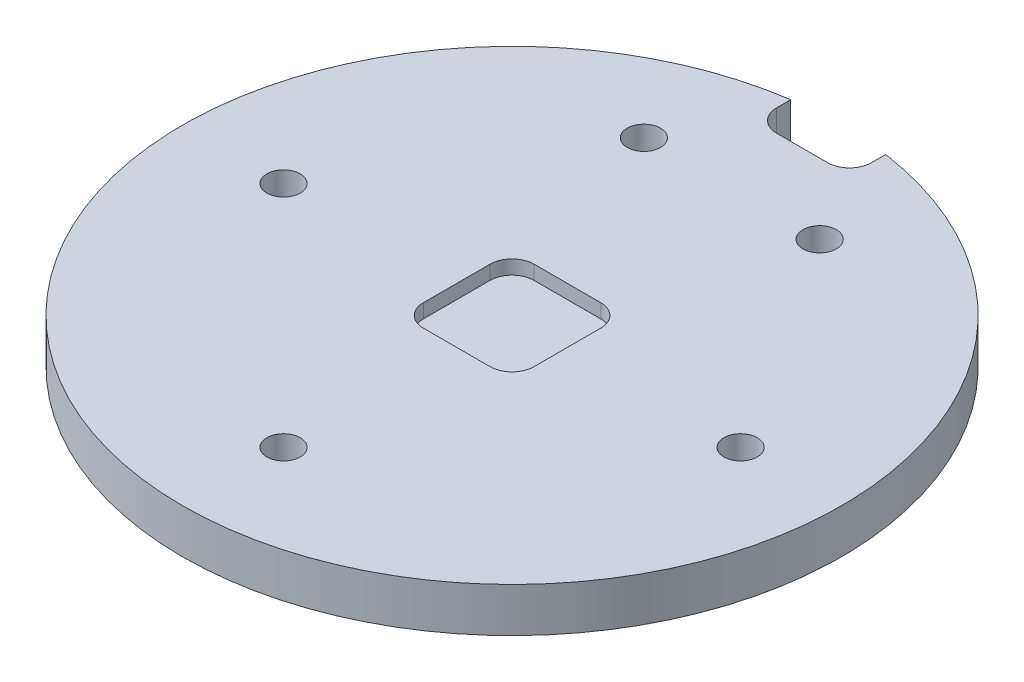
ISO-10303-21;
HEADER;
FILE_DESCRIPTION(('STEP AP214'),'2;1');
FILE_NAME('part.step','',(''),(''),'','','');
FILE_SCHEMA(('AUTOMOTIVE_DESIGN { 1 0 10303 214 1 1 1 1 }'));
ENDSEC;
DATA;
#1=APPLICATION_CONTEXT('core data for automotive mechanical design processes');
#2=APPLICATION_PROTOCOL_DEFINITION('international standard','automotive_design',2000,#1);
#3=PRODUCT_CONTEXT('',#1,'mechanical');
#4=PRODUCT('Part','Part','',(#3));
#5=PRODUCT_RELATED_PRODUCT_CATEGORY('part','',(#4));
#6=PRODUCT_DEFINITION_FORMATION('','',#4);
#7=PRODUCT_DEFINITION_CONTEXT('part definition',#1,'design');
#8=PRODUCT_DEFINITION('design','',#6,#7);
#9=PRODUCT_DEFINITION_SHAPE('','',#8);
#10=(LENGTH_UNIT() NAMED_UNIT(*) SI_UNIT(.MILLI.,.METRE.));
#11=(NAMED_UNIT(*) PLANE_ANGLE_UNIT() SI_UNIT($,.RADIAN.));
#12=(NAMED_UNIT(*) SI_UNIT($,.STERADIAN.) SOLID_ANGLE_UNIT());
#13=UNCERTAINTY_MEASURE_WITH_UNIT(LENGTH_MEASURE(1.E-05),#10,'distance_accuracy_value','');
#14=(GEOMETRIC_REPRESENTATION_CONTEXT(3) GLOBAL_UNCERTAINTY_ASSIGNED_CONTEXT((#13)) GLOBAL_UNIT_ASSIGNED_CONTEXT((#10,
#11,#12)) REPRESENTATION_CONTEXT('',''));
#15=CARTESIAN_POINT('',(0.,0.,0.));
#16=DIRECTION('',(0.,0.,1.));
#17=DIRECTION('',(1.,0.,0.));
#18=AXIS2_PLACEMENT_3D('',#15,#16,#17);
#19=CARTESIAN_POINT('',(-6.85799999999999,0.0500000000000014,-38.493867511592));
#20=DIRECTION('',(0.,1.,0.));
#21=DIRECTION('',(0.,0.,1.));
#22=AXIS2_PLACEMENT_3D('',#19,#20,#21);
#23=PLANE('',#22);
#24=CARTESIAN_POINT('',(12.7,0.0500000000000014,-31.75));
#25=DIRECTION('',(0.,1.,0.));
#26=DIRECTION('',(0.,0.,1.));
#27=AXIS2_PLACEMENT_3D('',#24,#25,#26);
#28=CIRCLE('',#27,2.413);
#29=CARTESIAN_POINT('',(12.7,0.0500000000000014,-29.337));
#30=VERTEX_POINT('',#29);
#31=EDGE_CURVE('E458',#30,#30,#28,.T.);
#32=ORIENTED_EDGE('',*,*,#31,.F.);
#33=EDGE_LOOP('',(#32));
#34=FACE_BOUND('',#33,.T.);
#35=CARTESIAN_POINT('',(-12.7,0.0500000000000014,-31.75));
#36=DIRECTION('',(0.,1.,0.));
#37=DIRECTION('',(0.,0.,1.));
#38=AXIS2_PLACEMENT_3D('',#35,#36,#37);
#39=CIRCLE('',#38,2.413);
#40=CARTESIAN_POINT('',(-12.7,0.0500000000000014,-29.337));
#41=VERTEX_POINT('',#40);
#42=EDGE_CURVE('E460',#41,#41,#39,.T.);
#43=ORIENTED_EDGE('',*,*,#42,.F.);
#44=EDGE_LOOP('',(#43));
#45=FACE_BOUND('',#44,.T.);
#46=CARTESIAN_POINT('',(0.,0.0500000000000014,33.02));
#47=DIRECTION('',(0.,1.,0.));
#48=DIRECTION('',(0.,0.,1.));
#49=AXIS2_PLACEMENT_3D('',#46,#47,#48);
#50=CIRCLE('',#49,2.413);
#51=CARTESIAN_POINT('',(0.,0.0500000000000014,35.433));
#52=VERTEX_POINT('',#51);
#53=EDGE_CURVE('E466',#52,#52,#50,.T.);
#54=ORIENTED_EDGE('',*,*,#53,.F.);
#55=EDGE_LOOP('',(#54));
#56=FACE_BOUND('',#55,.T.);
#57=CARTESIAN_POINT('',(33.02,0.0500000000000014,0.));
#58=DIRECTION('',(0.,1.,0.));
#59=DIRECTION('',(0.,0.,1.));
#60=AXIS2_PLACEMENT_3D('',#57,#58,#59);
#61=CIRCLE('',#60,2.413);
#62=CARTESIAN_POINT('',(33.02,0.0500000000000014,2.413));
#63=VERTEX_POINT('',#62);
#64=EDGE_CURVE('E472',#63,#63,#61,.T.);
#65=ORIENTED_EDGE('',*,*,#64,.F.);
#66=EDGE_LOOP('',(#65));
#67=FACE_BOUND('',#66,.T.);
#68=CARTESIAN_POINT('',(-33.02,0.0500000000000014,0.));
#69=DIRECTION('',(0.,1.,0.));
#70=DIRECTION('',(0.,0.,1.));
#71=AXIS2_PLACEMENT_3D('',#68,#69,#70);
#72=CIRCLE('',#71,2.413);
#73=CARTESIAN_POINT('',(-33.02,0.0500000000000014,2.413));
#74=VERTEX_POINT('',#73);
#75=EDGE_CURVE('E478',#74,#74,#72,.T.);
#76=ORIENTED_EDGE('',*,*,#75,.F.);
#77=EDGE_LOOP('',(#76));
#78=FACE_BOUND('',#77,.T.);
#79=DIRECTION('',(0.,0.,-1.));
#80=VECTOR('',#79,1.);
#81=CARTESIAN_POINT('',(6.85799999999999,0.0500000000000014,-41.91));
#82=LINE('',#81,#80);
#83=CARTESIAN_POINT('',(6.85799999999999,0.0500000000000014,-45.085));
#84=VERTEX_POINT('',#83);
#85=CARTESIAN_POINT('',(6.85799999999999,0.0500000000000014,-47.1286373768646));
#86=VERTEX_POINT('',#85);
#87=EDGE_CURVE('E168',#84,#86,#82,.T.);
#88=ORIENTED_EDGE('',*,*,#87,.F.);
#89=CARTESIAN_POINT('',(3.68299999999999,0.0500000000000014,-45.085));
#90=DIRECTION('',(0.,1.,0.));
#91=DIRECTION('',(0.,0.,1.));
#92=AXIS2_PLACEMENT_3D('',#89,#90,#91);
#93=CIRCLE('',#92,3.175);
#94=CARTESIAN_POINT('',(3.68299999999999,0.0500000000000014,-41.91));
#95=VERTEX_POINT('',#94);
#96=EDGE_CURVE('E215',#84,#95,#93,.F.);
#97=ORIENTED_EDGE('',*,*,#96,.T.);
#98=DIRECTION('',(1.,0.,0.));
#99=VECTOR('',#98,1.);
#100=CARTESIAN_POINT('',(6.85799999999999,0.0500000000000014,-41.91));
#101=LINE('',#100,#99);
#102=CARTESIAN_POINT('',(-3.68300000000003,0.0500000000000014,-41.91));
#103=VERTEX_POINT('',#102);
#104=EDGE_CURVE('E167',#103,#95,#101,.T.);
#105=ORIENTED_EDGE('',*,*,#104,.F.);
#106=CARTESIAN_POINT('',(-3.68300000000003,0.0500000000000014,-45.085));
#107=DIRECTION('',(0.,1.,0.));
#108=DIRECTION('',(0.,0.,1.));
#109=AXIS2_PLACEMENT_3D('',#106,#107,#108);
#110=CIRCLE('',#109,3.175);
#111=CARTESIAN_POINT('',(-6.85800000000003,0.0500000000000014,-45.085));
#112=VERTEX_POINT('',#111);
#113=EDGE_CURVE('E166',#103,#112,#110,.F.);
#114=ORIENTED_EDGE('',*,*,#113,.T.);
#115=DIRECTION('',(0.,0.,1.));
#116=VECTOR('',#115,1.);
#117=CARTESIAN_POINT('',(-6.85800000000003,0.0500000000000014,-41.91));
#118=LINE('',#117,#116);
#119=CARTESIAN_POINT('',(-6.85800000000003,0.0500000000000014,-47.1286373768646));
#120=VERTEX_POINT('',#119);
#121=EDGE_CURVE('E150',#120,#112,#118,.T.);
#122=ORIENTED_EDGE('',*,*,#121,.F.);
#123=CARTESIAN_POINT('',(0.,0.0500000000000014,0.));
#124=DIRECTION('',(0.,1.,0.));
#125=DIRECTION('',(0.,0.,1.));
#126=AXIS2_PLACEMENT_3D('',#123,#124,#125);
#127=CIRCLE('',#126,47.625);
#128=EDGE_CURVE('E164',#86,#120,#127,.F.);
#129=ORIENTED_EDGE('',*,*,#128,.F.);
#130=EDGE_LOOP('',(#88,#97,#105,#114,#122,#129));
#131=FACE_BOUND('',#130,.T.);
#132=DIRECTION('',(0.,0.,-1.));
#133=VECTOR('',#132,1.);
#134=CARTESIAN_POINT('',(8.,0.0500000000000014,-8.00000000000001));
#135=LINE('',#134,#133);
#136=CARTESIAN_POINT('',(8.,0.0500000000000014,4.82499999999999));
#137=VERTEX_POINT('',#136);
#138=CARTESIAN_POINT('',(8.,0.0500000000000014,-4.82500000000001));
#139=VERTEX_POINT('',#138);
#140=EDGE_CURVE('E189',#137,#139,#135,.T.);
#141=ORIENTED_EDGE('',*,*,#140,.F.);
#142=CARTESIAN_POINT('',(4.825,0.0500000000000014,4.82499999999999));
#143=DIRECTION('',(0.,1.,0.));
#144=DIRECTION('',(0.,0.,1.));
#145=AXIS2_PLACEMENT_3D('',#142,#143,#144);
#146=CIRCLE('',#145,3.175);
#147=CARTESIAN_POINT('',(4.825,0.0500000000000014,7.99999999999999));
#148=VERTEX_POINT('',#147);
#149=EDGE_CURVE('E13',#137,#148,#146,.F.);
#150=ORIENTED_EDGE('',*,*,#149,.T.);
#151=DIRECTION('',(1.,0.,0.));
#152=VECTOR('',#151,1.);
#153=CARTESIAN_POINT('',(-8.,0.0500000000000014,7.99999999999999));
#154=LINE('',#153,#152);
#155=CARTESIAN_POINT('',(-4.825,0.0500000000000014,7.99999999999999));
#156=VERTEX_POINT('',#155);
#157=EDGE_CURVE('E179',#156,#148,#154,.T.);
#158=ORIENTED_EDGE('',*,*,#157,.F.);
#159=CARTESIAN_POINT('',(-4.825,0.0500000000000014,4.82499999999999));
#160=DIRECTION('',(0.,1.,0.));
#161=DIRECTION('',(0.,0.,1.));
#162=AXIS2_PLACEMENT_3D('',#159,#160,#161);
#163=CIRCLE('',#162,3.175);
#164=CARTESIAN_POINT('',(-8.,0.0500000000000014,4.82499999999999));
#165=VERTEX_POINT('',#164);
#166=EDGE_CURVE('E248',#156,#165,#163,.F.);
#167=ORIENTED_EDGE('',*,*,#166,.T.);
#168=DIRECTION('',(0.,0.,1.));
#169=VECTOR('',#168,1.);
#170=CARTESIAN_POINT('',(-8.,0.0500000000000014,-8.00000000000001));
#171=LINE('',#170,#169);
#172=CARTESIAN_POINT('',(-8.,0.0500000000000014,-4.82500000000001));
#173=VERTEX_POINT('',#172);
#174=EDGE_CURVE('E182',#173,#165,#171,.T.);
#175=ORIENTED_EDGE('',*,*,#174,.F.);
#176=CARTESIAN_POINT('',(-4.825,0.0500000000000014,-4.82500000000001));
#177=DIRECTION('',(0.,1.,0.));
#178=DIRECTION('',(0.,0.,1.));
#179=AXIS2_PLACEMENT_3D('',#176,#177,#178);
#180=CIRCLE('',#179,3.175);
#181=CARTESIAN_POINT('',(-4.825,0.0500000000000014,-8.00000000000001));
#182=VERTEX_POINT('',#181);
#183=EDGE_CURVE('E246',#173,#182,#180,.F.);
#184=ORIENTED_EDGE('',*,*,#183,.T.);
#185=DIRECTION('',(-1.,0.,0.));
#186=VECTOR('',#185,1.);
#187=CARTESIAN_POINT('',(-8.,0.0500000000000014,-8.00000000000001));
#188=LINE('',#187,#186);
#189=CARTESIAN_POINT('',(4.825,0.0500000000000014,-8.00000000000001));
#190=VERTEX_POINT('',#189);
#191=EDGE_CURVE('E186',#190,#182,#188,.T.);
#192=ORIENTED_EDGE('',*,*,#191,.F.);
#193=CARTESIAN_POINT('',(4.825,0.0500000000000014,-4.82500000000001));
#194=DIRECTION('',(0.,1.,0.));
#195=DIRECTION('',(0.,0.,1.));
#196=AXIS2_PLACEMENT_3D('',#193,#194,#195);
#197=CIRCLE('',#196,3.175);
#198=EDGE_CURVE('E55',#190,#139,#197,.F.);
#199=ORIENTED_EDGE('',*,*,#198,.T.);
#200=EDGE_LOOP('',(#141,#150,#158,#167,#175,#184,#192,#199));
#201=FACE_BOUND('',#200,.T.);
#202=ADVANCED_FACE('F47',(#34,#45,#56,#67,#78,#131,#201),#23,.T.);
#203=CARTESIAN_POINT('',(-8.,-1.982,7.99999999999999));
#204=DIRECTION('',(0.,0.,1.));
#205=DIRECTION('',(1.,0.,0.));
#206=AXIS2_PLACEMENT_3D('',#203,#204,#205);
#207=PLANE('',#206);
#208=DIRECTION('',(1.,0.,0.));
#209=VECTOR('',#208,1.);
#210=CARTESIAN_POINT('',(-8.,-1.982,7.99999999999999));
#211=LINE('',#210,#209);
#212=CARTESIAN_POINT('',(-4.825,-1.982,7.99999999999999));
#213=VERTEX_POINT('',#212);
#214=CARTESIAN_POINT('',(4.825,-1.982,7.99999999999999));
#215=VERTEX_POINT('',#214);
#216=EDGE_CURVE('E175',#213,#215,#211,.T.);
#217=ORIENTED_EDGE('',*,*,#216,.F.);
#218=DIRECTION('',(0.,1.,0.));
#219=VECTOR('',#218,1.);
#220=CARTESIAN_POINT('',(-4.825,0.0500000000000014,7.99999999999999));
#221=LINE('',#220,#219);
#222=EDGE_CURVE('E239',#213,#156,#221,.T.);
#223=ORIENTED_EDGE('',*,*,#222,.T.);
#224=ORIENTED_EDGE('',*,*,#157,.T.);
#225=DIRECTION('',(0.,1.,0.));
#226=VECTOR('',#225,1.);
#227=CARTESIAN_POINT('',(4.825,-1.982,7.99999999999999));
#228=LINE('',#227,#226);
#229=EDGE_CURVE('E237',#148,#215,#228,.F.);
#230=ORIENTED_EDGE('',*,*,#229,.T.);
#231=EDGE_LOOP('',(#217,#223,#224,#230));
#232=FACE_BOUND('',#231,.T.);
#233=ADVANCED_FACE('F265',(#232),#207,.F.);
#234=CARTESIAN_POINT('',(8.,-1.982,-8.00000000000001));
#235=DIRECTION('',(1.,0.,0.));
#236=DIRECTION('',(0.,0.,-1.));
#237=AXIS2_PLACEMENT_3D('',#234,#235,#236);
#238=PLANE('',#237);
#239=ORIENTED_EDGE('',*,*,#140,.T.);
#240=DIRECTION('',(0.,1.,0.));
#241=VECTOR('',#240,1.);
#242=CARTESIAN_POINT('',(8.,-1.982,-4.82500000000001));
#243=LINE('',#242,#241);
#244=CARTESIAN_POINT('',(8.,-1.982,-4.82500000000001));
#245=VERTEX_POINT('',#244);
#246=EDGE_CURVE('E244',#139,#245,#243,.F.);
#247=ORIENTED_EDGE('',*,*,#246,.T.);
#248=DIRECTION('',(0.,0.,-1.));
#249=VECTOR('',#248,1.);
#250=CARTESIAN_POINT('',(8.,-1.982,-8.00000000000001));
#251=LINE('',#250,#249);
#252=CARTESIAN_POINT('',(8.,-1.982,4.82499999999999));
#253=VERTEX_POINT('',#252);
#254=EDGE_CURVE('E183',#253,#245,#251,.T.);
#255=ORIENTED_EDGE('',*,*,#254,.F.);
#256=DIRECTION('',(0.,1.,0.));
#257=VECTOR('',#256,1.);
#258=CARTESIAN_POINT('',(8.,0.0500000000000014,4.82499999999999));
#259=LINE('',#258,#257);
#260=EDGE_CURVE('E242',#253,#137,#259,.T.);
#261=ORIENTED_EDGE('',*,*,#260,.T.);
#262=EDGE_LOOP('',(#239,#247,#255,#261));
#263=FACE_BOUND('',#262,.T.);
#264=ADVANCED_FACE('F269',(#263),#238,.F.);
#265=CARTESIAN_POINT('',(0.,-1.982,0.));
#266=DIRECTION('',(0.,1.,0.));
#267=DIRECTION('',(0.,0.,1.));
#268=AXIS2_PLACEMENT_3D('',#265,#266,#267);
#269=PLANE('',#268);
#270=DIRECTION('',(-1.,0.,0.));
#271=VECTOR('',#270,1.);
#272=CARTESIAN_POINT('',(-8.,-1.982,-8.00000000000001));
#273=LINE('',#272,#271);
#274=CARTESIAN_POINT('',(4.825,-1.982,-8.00000000000001));
#275=VERTEX_POINT('',#274);
#276=CARTESIAN_POINT('',(-4.825,-1.982,-8.00000000000001));
#277=VERTEX_POINT('',#276);
#278=EDGE_CURVE('E196',#275,#277,#273,.T.);
#279=ORIENTED_EDGE('',*,*,#278,.T.);
#280=CARTESIAN_POINT('',(-4.825,-1.982,-4.82500000000001));
#281=DIRECTION('',(0.,1.,0.));
#282=DIRECTION('',(0.,0.,1.));
#283=AXIS2_PLACEMENT_3D('',#280,#281,#282);
#284=CIRCLE('',#283,3.175);
#285=CARTESIAN_POINT('',(-8.,-1.982,-4.82500000000001));
#286=VERTEX_POINT('',#285);
#287=EDGE_CURVE('E235',#277,#286,#284,.T.);
#288=ORIENTED_EDGE('',*,*,#287,.T.);
#289=DIRECTION('',(0.,0.,1.));
#290=VECTOR('',#289,1.);
#291=CARTESIAN_POINT('',(-8.,-1.982,-8.00000000000001));
#292=LINE('',#291,#290);
#293=CARTESIAN_POINT('',(-8.,-1.982,4.82499999999999));
#294=VERTEX_POINT('',#293);
#295=EDGE_CURVE('E193',#286,#294,#292,.T.);
#296=ORIENTED_EDGE('',*,*,#295,.T.);
#297=CARTESIAN_POINT('',(-4.825,-1.982,4.82499999999999));
#298=DIRECTION('',(0.,1.,0.));
#299=DIRECTION('',(0.,0.,1.));
#300=AXIS2_PLACEMENT_3D('',#297,#298,#299);
#301=CIRCLE('',#300,3.175);
#302=EDGE_CURVE('E233',#294,#213,#301,.T.);
#303=ORIENTED_EDGE('',*,*,#302,.T.);
#304=ORIENTED_EDGE('',*,*,#216,.T.);
#305=CARTESIAN_POINT('',(4.825,-1.982,4.82499999999999));
#306=DIRECTION('',(0.,1.,0.));
#307=DIRECTION('',(0.,0.,1.));
#308=AXIS2_PLACEMENT_3D('',#305,#306,#307);
#309=CIRCLE('',#308,3.175);
#310=EDGE_CURVE('E229',#215,#253,#309,.T.);
#311=ORIENTED_EDGE('',*,*,#310,.T.);
#312=ORIENTED_EDGE('',*,*,#254,.T.);
#313=CARTESIAN_POINT('',(4.825,-1.982,-4.82500000000001));
#314=DIRECTION('',(0.,1.,0.));
#315=DIRECTION('',(0.,0.,1.));
#316=AXIS2_PLACEMENT_3D('',#313,#314,#315);
#317=CIRCLE('',#316,3.175);
#318=EDGE_CURVE('E231',#245,#275,#317,.T.);
#319=ORIENTED_EDGE('',*,*,#318,.T.);
#320=EDGE_LOOP('',(#279,#288,#296,#303,#304,#311,#312,#319));
#321=FACE_BOUND('',#320,.T.);
#322=ADVANCED_FACE('F262',(#321),#269,.T.);
#323=CARTESIAN_POINT('',(-8.,-1.982,-8.00000000000001));
#324=DIRECTION('',(-1.,0.,0.));
#325=DIRECTION('',(0.,0.,1.));
#326=AXIS2_PLACEMENT_3D('',#323,#324,#325);
#327=PLANE('',#326);
#328=ORIENTED_EDGE('',*,*,#295,.F.);
#329=DIRECTION('',(0.,1.,0.));
#330=VECTOR('',#329,1.);
#331=CARTESIAN_POINT('',(-8.,0.0500000000000014,-4.82500000000001));
#332=LINE('',#331,#330);
#333=EDGE_CURVE('E221',#286,#173,#332,.T.);
#334=ORIENTED_EDGE('',*,*,#333,.T.);
#335=ORIENTED_EDGE('',*,*,#174,.T.);
#336=DIRECTION('',(0.,1.,0.));
#337=VECTOR('',#336,1.);
#338=CARTESIAN_POINT('',(-8.,-1.982,4.82499999999999));
#339=LINE('',#338,#337);
#340=EDGE_CURVE('E219',#165,#294,#339,.F.);
#341=ORIENTED_EDGE('',*,*,#340,.T.);
#342=EDGE_LOOP('',(#328,#334,#335,#341));
#343=FACE_BOUND('',#342,.T.);
#344=ADVANCED_FACE('F256',(#343),#327,.F.);
#345=CARTESIAN_POINT('',(-8.,-1.982,-8.00000000000001));
#346=DIRECTION('',(0.,0.,-1.));
#347=DIRECTION('',(-1.,0.,0.));
#348=AXIS2_PLACEMENT_3D('',#345,#346,#347);
#349=PLANE('',#348);
#350=ORIENTED_EDGE('',*,*,#191,.T.);
#351=DIRECTION('',(0.,1.,0.));
#352=VECTOR('',#351,1.);
#353=CARTESIAN_POINT('',(-4.825,-1.982,-8.00000000000001));
#354=LINE('',#353,#352);
#355=EDGE_CURVE('E227',#182,#277,#354,.F.);
#356=ORIENTED_EDGE('',*,*,#355,.T.);
#357=ORIENTED_EDGE('',*,*,#278,.F.);
#358=DIRECTION('',(0.,1.,0.));
#359=VECTOR('',#358,1.);
#360=CARTESIAN_POINT('',(4.825,0.0500000000000014,-8.00000000000001));
#361=LINE('',#360,#359);
#362=EDGE_CURVE('E224',#275,#190,#361,.T.);
#363=ORIENTED_EDGE('',*,*,#362,.T.);
#364=EDGE_LOOP('',(#350,#356,#357,#363));
#365=FACE_BOUND('',#364,.T.);
#366=ADVANCED_FACE('F277',(#365),#349,.F.);
#367=CARTESIAN_POINT('',(0.,-6.35,0.));
#368=DIRECTION('',(0.,1.,0.));
#369=DIRECTION('',(0.,0.,1.));
#370=AXIS2_PLACEMENT_3D('',#367,#368,#369);
#371=CYLINDRICAL_SURFACE('',#370,47.625);
#372=DIRECTION('',(0.,1.,0.));
#373=VECTOR('',#372,1.);
#374=CARTESIAN_POINT('',(6.85799999999999,-6.35,-47.1286373768646));
#375=LINE('',#374,#373);
#376=CARTESIAN_POINT('',(6.85799999999999,-6.35,-47.1286373768646));
#377=VERTEX_POINT('',#376);
#378=EDGE_CURVE('E158',#86,#377,#375,.F.);
#379=ORIENTED_EDGE('',*,*,#378,.F.);
#380=ORIENTED_EDGE('',*,*,#128,.T.);
#381=DIRECTION('',(0.,1.,0.));
#382=VECTOR('',#381,1.);
#383=CARTESIAN_POINT('',(-6.85800000000003,-6.35,-47.1286373768646));
#384=LINE('',#383,#382);
#385=CARTESIAN_POINT('',(-6.85800000000003,-6.35,-47.1286373768646));
#386=VERTEX_POINT('',#385);
#387=EDGE_CURVE('E147',#386,#120,#384,.T.);
#388=ORIENTED_EDGE('',*,*,#387,.F.);
#389=CARTESIAN_POINT('',(0.,-6.35,0.));
#390=DIRECTION('',(0.,1.,0.));
#391=DIRECTION('',(0.,0.,1.));
#392=AXIS2_PLACEMENT_3D('',#389,#390,#391);
#393=CIRCLE('',#392,47.625);
#394=EDGE_CURVE('E173',#386,#377,#393,.T.);
#395=ORIENTED_EDGE('',*,*,#394,.T.);
#396=EDGE_LOOP('',(#379,#380,#388,#395));
#397=FACE_BOUND('',#396,.T.);
#398=ADVANCED_FACE('F171',(#397),#371,.T.);
#399=CARTESIAN_POINT('',(0.,-6.35,0.));
#400=DIRECTION('',(0.,1.,0.));
#401=DIRECTION('',(0.,0.,1.));
#402=AXIS2_PLACEMENT_3D('',#399,#400,#401);
#403=PLANE('',#402);
#404=CARTESIAN_POINT('',(12.7,-6.35,-31.75));
#405=DIRECTION('',(0.,1.,0.));
#406=DIRECTION('',(0.,0.,1.));
#407=AXIS2_PLACEMENT_3D('',#404,#405,#406);
#408=CIRCLE('',#407,2.413);
#409=CARTESIAN_POINT('',(12.7,-6.35,-29.337));
#410=VERTEX_POINT('',#409);
#411=EDGE_CURVE('E455',#410,#410,#408,.T.);
#412=ORIENTED_EDGE('',*,*,#411,.T.);
#413=EDGE_LOOP('',(#412));
#414=FACE_BOUND('',#413,.T.);
#415=CARTESIAN_POINT('',(-12.7,-6.35,-31.75));
#416=DIRECTION('',(0.,1.,0.));
#417=DIRECTION('',(0.,0.,1.));
#418=AXIS2_PLACEMENT_3D('',#415,#416,#417);
#419=CIRCLE('',#418,2.413);
#420=CARTESIAN_POINT('',(-12.7,-6.35,-29.337));
#421=VERTEX_POINT('',#420);
#422=EDGE_CURVE('E463',#421,#421,#419,.T.);
#423=ORIENTED_EDGE('',*,*,#422,.T.);
#424=EDGE_LOOP('',(#423));
#425=FACE_BOUND('',#424,.T.);
#426=CARTESIAN_POINT('',(0.,-6.35,33.02));
#427=DIRECTION('',(0.,1.,0.));
#428=DIRECTION('',(0.,0.,1.));
#429=AXIS2_PLACEMENT_3D('',#426,#427,#428);
#430=CIRCLE('',#429,2.413);
#431=CARTESIAN_POINT('',(0.,-6.35,35.433));
#432=VERTEX_POINT('',#431);
#433=EDGE_CURVE('E469',#432,#432,#430,.T.);
#434=ORIENTED_EDGE('',*,*,#433,.T.);
#435=EDGE_LOOP('',(#434));
#436=FACE_BOUND('',#435,.T.);
#437=CARTESIAN_POINT('',(33.02,-6.35,0.));
#438=DIRECTION('',(0.,1.,0.));
#439=DIRECTION('',(0.,0.,1.));
#440=AXIS2_PLACEMENT_3D('',#437,#438,#439);
#441=CIRCLE('',#440,2.413);
#442=CARTESIAN_POINT('',(33.02,-6.35,2.413));
#443=VERTEX_POINT('',#442);
#444=EDGE_CURVE('E475',#443,#443,#441,.T.);
#445=ORIENTED_EDGE('',*,*,#444,.T.);
#446=EDGE_LOOP('',(#445));
#447=FACE_BOUND('',#446,.T.);
#448=CARTESIAN_POINT('',(-33.02,-6.35,0.));
#449=DIRECTION('',(0.,1.,0.));
#450=DIRECTION('',(0.,0.,1.));
#451=AXIS2_PLACEMENT_3D('',#448,#449,#450);
#452=CIRCLE('',#451,2.413);
#453=CARTESIAN_POINT('',(-33.02,-6.35,2.413));
#454=VERTEX_POINT('',#453);
#455=EDGE_CURVE('E331',#454,#454,#452,.T.);
#456=ORIENTED_EDGE('',*,*,#455,.T.);
#457=EDGE_LOOP('',(#456));
#458=FACE_BOUND('',#457,.T.);
#459=DIRECTION('',(0.,0.,1.));
#460=VECTOR('',#459,1.);
#461=CARTESIAN_POINT('',(-6.85800000000003,-6.35,0.));
#462=LINE('',#461,#460);
#463=CARTESIAN_POINT('',(-6.85800000000003,-6.35,-45.085));
#464=VERTEX_POINT('',#463);
#465=EDGE_CURVE('E153',#386,#464,#462,.T.);
#466=ORIENTED_EDGE('',*,*,#465,.T.);
#467=CARTESIAN_POINT('',(-3.68300000000003,-6.35,-45.085));
#468=DIRECTION('',(0.,1.,0.));
#469=DIRECTION('',(0.,0.,1.));
#470=AXIS2_PLACEMENT_3D('',#467,#468,#469);
#471=CIRCLE('',#470,3.175);
#472=CARTESIAN_POINT('',(-3.68300000000003,-6.35,-41.91));
#473=VERTEX_POINT('',#472);
#474=EDGE_CURVE('E213',#464,#473,#471,.T.);
#475=ORIENTED_EDGE('',*,*,#474,.T.);
#476=DIRECTION('',(1.,0.,0.));
#477=VECTOR('',#476,1.);
#478=CARTESIAN_POINT('',(6.85799999999999,-6.35,-41.91));
#479=LINE('',#478,#477);
#480=CARTESIAN_POINT('',(3.68299999999999,-6.35,-41.91));
#481=VERTEX_POINT('',#480);
#482=EDGE_CURVE('E159',#473,#481,#479,.T.);
#483=ORIENTED_EDGE('',*,*,#482,.T.);
#484=CARTESIAN_POINT('',(3.68299999999999,-6.35,-45.085));
#485=DIRECTION('',(0.,1.,0.));
#486=DIRECTION('',(0.,0.,1.));
#487=AXIS2_PLACEMENT_3D('',#484,#485,#486);
#488=CIRCLE('',#487,3.175);
#489=CARTESIAN_POINT('',(6.85799999999999,-6.35,-45.085));
#490=VERTEX_POINT('',#489);
#491=EDGE_CURVE('E217',#481,#490,#488,.T.);
#492=ORIENTED_EDGE('',*,*,#491,.T.);
#493=DIRECTION('',(0.,0.,-1.));
#494=VECTOR('',#493,1.);
#495=CARTESIAN_POINT('',(6.85799999999999,-6.35,-41.91));
#496=LINE('',#495,#494);
#497=EDGE_CURVE('E326',#490,#377,#496,.T.);
#498=ORIENTED_EDGE('',*,*,#497,.T.);
#499=ORIENTED_EDGE('',*,*,#394,.F.);
#500=EDGE_LOOP('',(#466,#475,#483,#492,#498,#499));
#501=FACE_BOUND('',#500,.T.);
#502=ADVANCED_FACE('F302',(#414,#425,#436,#447,#458,#501),#403,.F.);
#503=CARTESIAN_POINT('',(6.85799999999999,-6.35,-41.91));
#504=DIRECTION('',(1.,0.,0.));
#505=DIRECTION('',(0.,0.,-1.));
#506=AXIS2_PLACEMENT_3D('',#503,#504,#505);
#507=PLANE('',#506);
#508=ORIENTED_EDGE('',*,*,#497,.F.);
#509=DIRECTION('',(0.,1.,0.));
#510=VECTOR('',#509,1.);
#511=CARTESIAN_POINT('',(6.85799999999999,0.0500000000000014,-45.085));
#512=LINE('',#511,#510);
#513=EDGE_CURVE('E209',#490,#84,#512,.T.);
#514=ORIENTED_EDGE('',*,*,#513,.T.);
#515=ORIENTED_EDGE('',*,*,#87,.T.);
#516=ORIENTED_EDGE('',*,*,#378,.T.);
#517=EDGE_LOOP('',(#508,#514,#515,#516));
#518=FACE_BOUND('',#517,.T.);
#519=ADVANCED_FACE('F301',(#518),#507,.F.);
#520=CARTESIAN_POINT('',(6.85799999999999,-6.35,-41.91));
#521=DIRECTION('',(0.,0.,1.));
#522=DIRECTION('',(1.,0.,0.));
#523=AXIS2_PLACEMENT_3D('',#520,#521,#522);
#524=PLANE('',#523);
#525=ORIENTED_EDGE('',*,*,#482,.F.);
#526=DIRECTION('',(0.,1.,0.));
#527=VECTOR('',#526,1.);
#528=CARTESIAN_POINT('',(-3.68300000000003,0.0500000000000014,-41.91));
#529=LINE('',#528,#527);
#530=EDGE_CURVE('E204',#473,#103,#529,.T.);
#531=ORIENTED_EDGE('',*,*,#530,.T.);
#532=ORIENTED_EDGE('',*,*,#104,.T.);
#533=DIRECTION('',(0.,1.,0.));
#534=VECTOR('',#533,1.);
#535=CARTESIAN_POINT('',(3.68299999999999,-6.35,-41.91));
#536=LINE('',#535,#534);
#537=EDGE_CURVE('E202',#95,#481,#536,.F.);
#538=ORIENTED_EDGE('',*,*,#537,.T.);
#539=EDGE_LOOP('',(#525,#531,#532,#538));
#540=FACE_BOUND('',#539,.T.);
#541=ADVANCED_FACE('F315',(#540),#524,.F.);
#542=CARTESIAN_POINT('',(-6.85800000000003,-6.35,-41.91));
#543=DIRECTION('',(-1.,0.,0.));
#544=DIRECTION('',(0.,0.,1.));
#545=AXIS2_PLACEMENT_3D('',#542,#543,#544);
#546=PLANE('',#545);
#547=ORIENTED_EDGE('',*,*,#121,.T.);
#548=DIRECTION('',(0.,1.,0.));
#549=VECTOR('',#548,1.);
#550=CARTESIAN_POINT('',(-6.85800000000003,-6.35,-45.085));
#551=LINE('',#550,#549);
#552=EDGE_CURVE('E207',#112,#464,#551,.F.);
#553=ORIENTED_EDGE('',*,*,#552,.T.);
#554=ORIENTED_EDGE('',*,*,#465,.F.);
#555=ORIENTED_EDGE('',*,*,#387,.T.);
#556=EDGE_LOOP('',(#547,#553,#554,#555));
#557=FACE_BOUND('',#556,.T.);
#558=ADVANCED_FACE('F149',(#557),#546,.F.);
#559=CARTESIAN_POINT('',(-3.68300000000003,-6.35,-45.085));
#560=DIRECTION('',(0.,-1.,0.));
#561=DIRECTION('',(0.,0.,-1.));
#562=AXIS2_PLACEMENT_3D('',#559,#560,#561);
#563=CYLINDRICAL_SURFACE('',#562,3.175);
#564=ORIENTED_EDGE('',*,*,#474,.F.);
#565=ORIENTED_EDGE('',*,*,#552,.F.);
#566=ORIENTED_EDGE('',*,*,#113,.F.);
#567=ORIENTED_EDGE('',*,*,#530,.F.);
#568=EDGE_LOOP('',(#564,#565,#566,#567));
#569=FACE_BOUND('',#568,.T.);
#570=ADVANCED_FACE('F289',(#569),#563,.F.);
#571=CARTESIAN_POINT('',(3.68299999999999,-6.35,-45.085));
#572=DIRECTION('',(0.,-1.,0.));
#573=DIRECTION('',(0.,0.,-1.));
#574=AXIS2_PLACEMENT_3D('',#571,#572,#573);
#575=CYLINDRICAL_SURFACE('',#574,3.175);
#576=ORIENTED_EDGE('',*,*,#491,.F.);
#577=ORIENTED_EDGE('',*,*,#537,.F.);
#578=ORIENTED_EDGE('',*,*,#96,.F.);
#579=ORIENTED_EDGE('',*,*,#513,.F.);
#580=EDGE_LOOP('',(#576,#577,#578,#579));
#581=FACE_BOUND('',#580,.T.);
#582=ADVANCED_FACE('F282',(#581),#575,.F.);
#583=CARTESIAN_POINT('',(-4.825,-1.982,-4.82500000000001));
#584=DIRECTION('',(0.,-1.,0.));
#585=DIRECTION('',(0.,0.,-1.));
#586=AXIS2_PLACEMENT_3D('',#583,#584,#585);
#587=CYLINDRICAL_SURFACE('',#586,3.175);
#588=ORIENTED_EDGE('',*,*,#287,.F.);
#589=ORIENTED_EDGE('',*,*,#355,.F.);
#590=ORIENTED_EDGE('',*,*,#183,.F.);
#591=ORIENTED_EDGE('',*,*,#333,.F.);
#592=EDGE_LOOP('',(#588,#589,#590,#591));
#593=FACE_BOUND('',#592,.T.);
#594=ADVANCED_FACE('F280',(#593),#587,.F.);
#595=CARTESIAN_POINT('',(-4.825,-1.982,4.82499999999999));
#596=DIRECTION('',(0.,-1.,0.));
#597=DIRECTION('',(0.,0.,-1.));
#598=AXIS2_PLACEMENT_3D('',#595,#596,#597);
#599=CYLINDRICAL_SURFACE('',#598,3.175);
#600=ORIENTED_EDGE('',*,*,#302,.F.);
#601=ORIENTED_EDGE('',*,*,#340,.F.);
#602=ORIENTED_EDGE('',*,*,#166,.F.);
#603=ORIENTED_EDGE('',*,*,#222,.F.);
#604=EDGE_LOOP('',(#600,#601,#602,#603));
#605=FACE_BOUND('',#604,.T.);
#606=ADVANCED_FACE('F259',(#605),#599,.F.);
#607=CARTESIAN_POINT('',(4.825,-1.982,-4.82500000000001));
#608=DIRECTION('',(0.,-1.,0.));
#609=DIRECTION('',(0.,0.,-1.));
#610=AXIS2_PLACEMENT_3D('',#607,#608,#609);
#611=CYLINDRICAL_SURFACE('',#610,3.175);
#612=ORIENTED_EDGE('',*,*,#318,.F.);
#613=ORIENTED_EDGE('',*,*,#246,.F.);
#614=ORIENTED_EDGE('',*,*,#198,.F.);
#615=ORIENTED_EDGE('',*,*,#362,.F.);
#616=EDGE_LOOP('',(#612,#613,#614,#615));
#617=FACE_BOUND('',#616,.T.);
#618=ADVANCED_FACE('F272',(#617),#611,.F.);
#619=CARTESIAN_POINT('',(4.825,-1.982,4.82499999999999));
#620=DIRECTION('',(0.,-1.,0.));
#621=DIRECTION('',(0.,0.,-1.));
#622=AXIS2_PLACEMENT_3D('',#619,#620,#621);
#623=CYLINDRICAL_SURFACE('',#622,3.175);
#624=ORIENTED_EDGE('',*,*,#310,.F.);
#625=ORIENTED_EDGE('',*,*,#229,.F.);
#626=ORIENTED_EDGE('',*,*,#149,.F.);
#627=ORIENTED_EDGE('',*,*,#260,.F.);
#628=EDGE_LOOP('',(#624,#625,#626,#627));
#629=FACE_BOUND('',#628,.T.);
#630=ADVANCED_FACE('F49',(#629),#623,.F.);
#631=CARTESIAN_POINT('',(-33.02,-6.35,0.));
#632=DIRECTION('',(0.,1.,0.));
#633=DIRECTION('',(0.,0.,1.));
#634=AXIS2_PLACEMENT_3D('',#631,#632,#633);
#635=CYLINDRICAL_SURFACE('',#634,2.413);
#636=ORIENTED_EDGE('',*,*,#455,.F.);
#637=EDGE_LOOP('',(#636));
#638=FACE_BOUND('',#637,.T.);
#639=ORIENTED_EDGE('',*,*,#75,.T.);
#640=EDGE_LOOP('',(#639));
#641=FACE_BOUND('',#640,.T.);
#642=ADVANCED_FACE('F412',(#638,#641),#635,.F.);
#643=CARTESIAN_POINT('',(33.02,-6.35,0.));
#644=DIRECTION('',(0.,1.,0.));
#645=DIRECTION('',(0.,0.,1.));
#646=AXIS2_PLACEMENT_3D('',#643,#644,#645);
#647=CYLINDRICAL_SURFACE('',#646,2.413);
#648=ORIENTED_EDGE('',*,*,#444,.F.);
#649=EDGE_LOOP('',(#648));
#650=FACE_BOUND('',#649,.T.);
#651=ORIENTED_EDGE('',*,*,#64,.T.);
#652=EDGE_LOOP('',(#651));
#653=FACE_BOUND('',#652,.T.);
#654=ADVANCED_FACE('F418',(#650,#653),#647,.F.);
#655=CARTESIAN_POINT('',(0.,-6.35,33.02));
#656=DIRECTION('',(0.,1.,0.));
#657=DIRECTION('',(0.,0.,1.));
#658=AXIS2_PLACEMENT_3D('',#655,#656,#657);
#659=CYLINDRICAL_SURFACE('',#658,2.413);
#660=ORIENTED_EDGE('',*,*,#433,.F.);
#661=EDGE_LOOP('',(#660));
#662=FACE_BOUND('',#661,.T.);
#663=ORIENTED_EDGE('',*,*,#53,.T.);
#664=EDGE_LOOP('',(#663));
#665=FACE_BOUND('',#664,.T.);
#666=ADVANCED_FACE('F426',(#662,#665),#659,.F.);
#667=CARTESIAN_POINT('',(-12.7,-6.35,-31.75));
#668=DIRECTION('',(0.,1.,0.));
#669=DIRECTION('',(0.,0.,1.));
#670=AXIS2_PLACEMENT_3D('',#667,#668,#669);
#671=CYLINDRICAL_SURFACE('',#670,2.413);
#672=ORIENTED_EDGE('',*,*,#422,.F.);
#673=EDGE_LOOP('',(#672));
#674=FACE_BOUND('',#673,.T.);
#675=ORIENTED_EDGE('',*,*,#42,.T.);
#676=EDGE_LOOP('',(#675));
#677=FACE_BOUND('',#676,.T.);
#678=ADVANCED_FACE('F434',(#674,#677),#671,.F.);
#679=CARTESIAN_POINT('',(12.7,-6.35,-31.75));
#680=DIRECTION('',(0.,1.,0.));
#681=DIRECTION('',(0.,0.,1.));
#682=AXIS2_PLACEMENT_3D('',#679,#680,#681);
#683=CYLINDRICAL_SURFACE('',#682,2.413);
#684=ORIENTED_EDGE('',*,*,#411,.F.);
#685=EDGE_LOOP('',(#684));
#686=FACE_BOUND('',#685,.T.);
#687=ORIENTED_EDGE('',*,*,#31,.T.);
#688=EDGE_LOOP('',(#687));
#689=FACE_BOUND('',#688,.T.);
#690=ADVANCED_FACE('F442',(#686,#689),#683,.F.);
#691=CLOSED_SHELL('',(#202,#233,#264,#322,#344,#366,#398,#502,#519,#541,#558,#570,#582,#594,
#606,#618,#630,#642,#654,#666,#678,#690));
#692=MANIFOLD_SOLID_BREP('B2',#691);
#693=ADVANCED_BREP_SHAPE_REPRESENTATION('',(#18,#692),#14);
#694=SHAPE_DEFINITION_REPRESENTATION(#9,#693);
ENDSEC;
END-ISO-10303-21;
